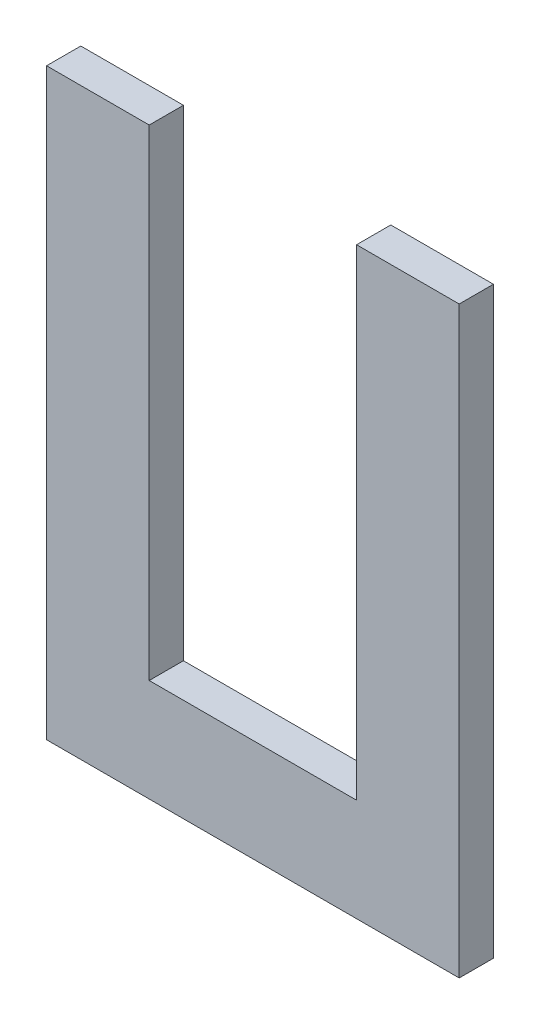
ISO-10303-21;
HEADER;
FILE_DESCRIPTION(('STEP AP214'),'2;1');
FILE_NAME('part.step','',(''),(''),'','','');
FILE_SCHEMA(('AUTOMOTIVE_DESIGN { 1 0 10303 214 1 1 1 1 }'));
ENDSEC;
DATA;
#1=APPLICATION_CONTEXT('core data for automotive mechanical design processes');
#2=APPLICATION_PROTOCOL_DEFINITION('international standard','automotive_design',2000,#1);
#3=PRODUCT_CONTEXT('',#1,'mechanical');
#4=PRODUCT('Part','Part','',(#3));
#5=PRODUCT_RELATED_PRODUCT_CATEGORY('part','',(#4));
#6=PRODUCT_DEFINITION_FORMATION('','',#4);
#7=PRODUCT_DEFINITION_CONTEXT('part definition',#1,'design');
#8=PRODUCT_DEFINITION('design','',#6,#7);
#9=PRODUCT_DEFINITION_SHAPE('','',#8);
#10=(LENGTH_UNIT() NAMED_UNIT(*) SI_UNIT(.MILLI.,.METRE.));
#11=(NAMED_UNIT(*) PLANE_ANGLE_UNIT() SI_UNIT($,.RADIAN.));
#12=(NAMED_UNIT(*) SI_UNIT($,.STERADIAN.) SOLID_ANGLE_UNIT());
#13=UNCERTAINTY_MEASURE_WITH_UNIT(LENGTH_MEASURE(1.E-05),#10,'distance_accuracy_value','');
#14=(GEOMETRIC_REPRESENTATION_CONTEXT(3) GLOBAL_UNCERTAINTY_ASSIGNED_CONTEXT((#13)) GLOBAL_UNIT_ASSIGNED_CONTEXT((#10,
#11,#12)) REPRESENTATION_CONTEXT('',''));
#15=CARTESIAN_POINT('',(0.,0.,0.));
#16=DIRECTION('',(0.,0.,1.));
#17=DIRECTION('',(1.,0.,0.));
#18=AXIS2_PLACEMENT_3D('',#15,#16,#17);
#19=CARTESIAN_POINT('',(-162.491930249026,-715.732729732174,5.));
#20=DIRECTION('',(-1.,0.,0.));
#21=DIRECTION('',(0.,0.,1.));
#22=AXIS2_PLACEMENT_3D('',#19,#20,#21);
#23=PLANE('',#22);
#24=DIRECTION('',(0.,1.,0.));
#25=VECTOR('',#24,1.);
#26=CARTESIAN_POINT('',(-162.491930249026,-715.732729732174,0.));
#27=LINE('',#26,#25);
#28=CARTESIAN_POINT('',(-162.491930249026,-786.032729732174,0.));
#29=VERTEX_POINT('',#28);
#30=CARTESIAN_POINT('',(-162.491930249026,-715.732729732174,0.));
#31=VERTEX_POINT('',#30);
#32=EDGE_CURVE('E146',#29,#31,#27,.T.);
#33=ORIENTED_EDGE('',*,*,#32,.T.);
#34=DIRECTION('',(0.,0.,-1.));
#35=VECTOR('',#34,1.);
#36=CARTESIAN_POINT('',(-162.491930249026,-715.732729732174,5.));
#37=LINE('',#36,#35);
#38=CARTESIAN_POINT('',(-162.491930249026,-715.732729732174,5.));
#39=VERTEX_POINT('',#38);
#40=EDGE_CURVE('E11',#39,#31,#37,.T.);
#41=ORIENTED_EDGE('',*,*,#40,.F.);
#42=DIRECTION('',(0.,1.,0.));
#43=VECTOR('',#42,1.);
#44=CARTESIAN_POINT('',(-162.491930249026,-715.732729732174,5.));
#45=LINE('',#44,#43);
#46=CARTESIAN_POINT('',(-162.491930249026,-786.032729732174,5.));
#47=VERTEX_POINT('',#46);
#48=EDGE_CURVE('E168',#47,#39,#45,.T.);
#49=ORIENTED_EDGE('',*,*,#48,.F.);
#50=DIRECTION('',(0.,0.,-1.));
#51=VECTOR('',#50,1.);
#52=CARTESIAN_POINT('',(-162.491930249026,-786.032729732174,5.));
#53=LINE('',#52,#51);
#54=EDGE_CURVE('E142',#47,#29,#53,.T.);
#55=ORIENTED_EDGE('',*,*,#54,.T.);
#56=EDGE_LOOP('',(#33,#41,#49,#55));
#57=FACE_BOUND('',#56,.T.);
#58=ADVANCED_FACE('F45',(#57),#23,.F.);
#59=CARTESIAN_POINT('',(-162.491930249026,-715.732729732174,5.));
#60=DIRECTION('',(0.,-1.,0.));
#61=DIRECTION('',(0.,0.,-1.));
#62=AXIS2_PLACEMENT_3D('',#59,#60,#61);
#63=PLANE('',#62);
#64=DIRECTION('',(-1.,0.,0.));
#65=VECTOR('',#64,1.);
#66=CARTESIAN_POINT('',(-162.491930249026,-715.732729732174,0.));
#67=LINE('',#66,#65);
#68=CARTESIAN_POINT('',(-177.491930249026,-715.732729732174,0.));
#69=VERTEX_POINT('',#68);
#70=EDGE_CURVE('E150',#31,#69,#67,.T.);
#71=ORIENTED_EDGE('',*,*,#70,.T.);
#72=DIRECTION('',(0.,0.,-1.));
#73=VECTOR('',#72,1.);
#74=CARTESIAN_POINT('',(-177.491930249026,-715.732729732174,5.));
#75=LINE('',#74,#73);
#76=CARTESIAN_POINT('',(-177.491930249026,-715.732729732174,5.));
#77=VERTEX_POINT('',#76);
#78=EDGE_CURVE('E54',#77,#69,#75,.T.);
#79=ORIENTED_EDGE('',*,*,#78,.F.);
#80=DIRECTION('',(-1.,0.,0.));
#81=VECTOR('',#80,1.);
#82=CARTESIAN_POINT('',(-162.491930249026,-715.732729732174,5.));
#83=LINE('',#82,#81);
#84=EDGE_CURVE('E105',#39,#77,#83,.T.);
#85=ORIENTED_EDGE('',*,*,#84,.F.);
#86=ORIENTED_EDGE('',*,*,#40,.T.);
#87=EDGE_LOOP('',(#71,#79,#85,#86));
#88=FACE_BOUND('',#87,.T.);
#89=ADVANCED_FACE('F214',(#88),#63,.F.);
#90=CARTESIAN_POINT('',(-177.491930249026,-715.732729732174,5.));
#91=DIRECTION('',(1.,0.,0.));
#92=DIRECTION('',(0.,0.,-1.));
#93=AXIS2_PLACEMENT_3D('',#90,#91,#92);
#94=PLANE('',#93);
#95=DIRECTION('',(0.,-1.,0.));
#96=VECTOR('',#95,1.);
#97=CARTESIAN_POINT('',(-177.491930249026,-715.732729732174,0.));
#98=LINE('',#97,#96);
#99=CARTESIAN_POINT('',(-177.491930249026,-801.032729732174,0.));
#100=VERTEX_POINT('',#99);
#101=EDGE_CURVE('E153',#69,#100,#98,.T.);
#102=ORIENTED_EDGE('',*,*,#101,.T.);
#103=DIRECTION('',(0.,0.,-1.));
#104=VECTOR('',#103,1.);
#105=CARTESIAN_POINT('',(-177.491930249026,-801.032729732174,5.));
#106=LINE('',#105,#104);
#107=CARTESIAN_POINT('',(-177.491930249026,-801.032729732174,5.));
#108=VERTEX_POINT('',#107);
#109=EDGE_CURVE('E179',#108,#100,#106,.T.);
#110=ORIENTED_EDGE('',*,*,#109,.F.);
#111=DIRECTION('',(0.,-1.,0.));
#112=VECTOR('',#111,1.);
#113=CARTESIAN_POINT('',(-177.491930249026,-715.732729732174,5.));
#114=LINE('',#113,#112);
#115=EDGE_CURVE('E189',#77,#108,#114,.T.);
#116=ORIENTED_EDGE('',*,*,#115,.F.);
#117=ORIENTED_EDGE('',*,*,#78,.T.);
#118=EDGE_LOOP('',(#102,#110,#116,#117));
#119=FACE_BOUND('',#118,.T.);
#120=ADVANCED_FACE('F187',(#119),#94,.F.);
#121=CARTESIAN_POINT('',(-177.491930249026,-801.032729732174,5.));
#122=DIRECTION('',(0.,1.,0.));
#123=DIRECTION('',(0.,0.,1.));
#124=AXIS2_PLACEMENT_3D('',#121,#122,#123);
#125=PLANE('',#124);
#126=DIRECTION('',(1.,0.,0.));
#127=VECTOR('',#126,1.);
#128=CARTESIAN_POINT('',(-177.491930249026,-801.032729732174,0.));
#129=LINE('',#128,#127);
#130=CARTESIAN_POINT('',(-117.191930249026,-801.032729732174,0.));
#131=VERTEX_POINT('',#130);
#132=EDGE_CURVE('E156',#100,#131,#129,.T.);
#133=ORIENTED_EDGE('',*,*,#132,.T.);
#134=DIRECTION('',(0.,0.,-1.));
#135=VECTOR('',#134,1.);
#136=CARTESIAN_POINT('',(-117.191930249026,-801.032729732174,5.));
#137=LINE('',#136,#135);
#138=CARTESIAN_POINT('',(-117.191930249026,-801.032729732174,5.));
#139=VERTEX_POINT('',#138);
#140=EDGE_CURVE('E175',#139,#131,#137,.T.);
#141=ORIENTED_EDGE('',*,*,#140,.F.);
#142=DIRECTION('',(1.,0.,0.));
#143=VECTOR('',#142,1.);
#144=CARTESIAN_POINT('',(-177.491930249026,-801.032729732174,5.));
#145=LINE('',#144,#143);
#146=EDGE_CURVE('E202',#108,#139,#145,.T.);
#147=ORIENTED_EDGE('',*,*,#146,.F.);
#148=ORIENTED_EDGE('',*,*,#109,.T.);
#149=EDGE_LOOP('',(#133,#141,#147,#148));
#150=FACE_BOUND('',#149,.T.);
#151=ADVANCED_FACE('F197',(#150),#125,.F.);
#152=CARTESIAN_POINT('',(-117.191930249026,-801.032729732174,5.));
#153=DIRECTION('',(-1.,0.,0.));
#154=DIRECTION('',(0.,0.,1.));
#155=AXIS2_PLACEMENT_3D('',#152,#153,#154);
#156=PLANE('',#155);
#157=DIRECTION('',(0.,1.,0.));
#158=VECTOR('',#157,1.);
#159=CARTESIAN_POINT('',(-117.191930249026,-801.032729732174,0.));
#160=LINE('',#159,#158);
#161=CARTESIAN_POINT('',(-117.191930249026,-715.732729732174,0.));
#162=VERTEX_POINT('',#161);
#163=EDGE_CURVE('E159',#131,#162,#160,.T.);
#164=ORIENTED_EDGE('',*,*,#163,.T.);
#165=DIRECTION('',(0.,0.,-1.));
#166=VECTOR('',#165,1.);
#167=CARTESIAN_POINT('',(-117.191930249026,-715.732729732174,5.));
#168=LINE('',#167,#166);
#169=CARTESIAN_POINT('',(-117.191930249026,-715.732729732174,5.));
#170=VERTEX_POINT('',#169);
#171=EDGE_CURVE('E135',#170,#162,#168,.T.);
#172=ORIENTED_EDGE('',*,*,#171,.F.);
#173=DIRECTION('',(0.,1.,0.));
#174=VECTOR('',#173,1.);
#175=CARTESIAN_POINT('',(-117.191930249026,-801.032729732174,5.));
#176=LINE('',#175,#174);
#177=EDGE_CURVE('E124',#139,#170,#176,.T.);
#178=ORIENTED_EDGE('',*,*,#177,.F.);
#179=ORIENTED_EDGE('',*,*,#140,.T.);
#180=EDGE_LOOP('',(#164,#172,#178,#179));
#181=FACE_BOUND('',#180,.T.);
#182=ADVANCED_FACE('F200',(#181),#156,.F.);
#183=CARTESIAN_POINT('',(-117.191930249026,-715.732729732174,5.));
#184=DIRECTION('',(0.,-1.,0.));
#185=DIRECTION('',(0.,0.,-1.));
#186=AXIS2_PLACEMENT_3D('',#183,#184,#185);
#187=PLANE('',#186);
#188=DIRECTION('',(-1.,0.,0.));
#189=VECTOR('',#188,1.);
#190=CARTESIAN_POINT('',(-117.191930249026,-715.732729732174,0.));
#191=LINE('',#190,#189);
#192=CARTESIAN_POINT('',(-132.191930249026,-715.732729732174,0.));
#193=VERTEX_POINT('',#192);
#194=EDGE_CURVE('E133',#162,#193,#191,.T.);
#195=ORIENTED_EDGE('',*,*,#194,.T.);
#196=DIRECTION('',(0.,0.,-1.));
#197=VECTOR('',#196,1.);
#198=CARTESIAN_POINT('',(-132.191930249026,-715.732729732174,5.));
#199=LINE('',#198,#197);
#200=CARTESIAN_POINT('',(-132.191930249026,-715.732729732174,5.));
#201=VERTEX_POINT('',#200);
#202=EDGE_CURVE('E130',#201,#193,#199,.T.);
#203=ORIENTED_EDGE('',*,*,#202,.F.);
#204=DIRECTION('',(-1.,0.,0.));
#205=VECTOR('',#204,1.);
#206=CARTESIAN_POINT('',(-117.191930249026,-715.732729732174,5.));
#207=LINE('',#206,#205);
#208=EDGE_CURVE('E118',#170,#201,#207,.T.);
#209=ORIENTED_EDGE('',*,*,#208,.F.);
#210=ORIENTED_EDGE('',*,*,#171,.T.);
#211=EDGE_LOOP('',(#195,#203,#209,#210));
#212=FACE_BOUND('',#211,.T.);
#213=ADVANCED_FACE('F131',(#212),#187,.F.);
#214=CARTESIAN_POINT('',(-132.191930249026,-715.732729732174,5.));
#215=DIRECTION('',(1.,0.,0.));
#216=DIRECTION('',(0.,1.,0.));
#217=AXIS2_PLACEMENT_3D('',#214,#215,#216);
#218=PLANE('',#217);
#219=DIRECTION('',(0.,-1.,0.));
#220=VECTOR('',#219,1.);
#221=CARTESIAN_POINT('',(-132.191930249026,-715.732729732174,0.));
#222=LINE('',#221,#220);
#223=CARTESIAN_POINT('',(-132.191930249026,-786.032729732174,0.));
#224=VERTEX_POINT('',#223);
#225=EDGE_CURVE('E91',#193,#224,#222,.T.);
#226=ORIENTED_EDGE('',*,*,#225,.T.);
#227=DIRECTION('',(0.,0.,-1.));
#228=VECTOR('',#227,1.);
#229=CARTESIAN_POINT('',(-132.191930249026,-786.032729732174,5.));
#230=LINE('',#229,#228);
#231=CARTESIAN_POINT('',(-132.191930249026,-786.032729732174,5.));
#232=VERTEX_POINT('',#231);
#233=EDGE_CURVE('E136',#232,#224,#230,.T.);
#234=ORIENTED_EDGE('',*,*,#233,.F.);
#235=DIRECTION('',(0.,-1.,0.));
#236=VECTOR('',#235,1.);
#237=CARTESIAN_POINT('',(-132.191930249026,-715.732729732174,5.));
#238=LINE('',#237,#236);
#239=EDGE_CURVE('E122',#201,#232,#238,.T.);
#240=ORIENTED_EDGE('',*,*,#239,.F.);
#241=ORIENTED_EDGE('',*,*,#202,.T.);
#242=EDGE_LOOP('',(#226,#234,#240,#241));
#243=FACE_BOUND('',#242,.T.);
#244=ADVANCED_FACE('F138',(#243),#218,.F.);
#245=CARTESIAN_POINT('',(-162.491930249026,-786.032729732174,5.));
#246=DIRECTION('',(0.,-1.,0.));
#247=DIRECTION('',(0.,0.,-1.));
#248=AXIS2_PLACEMENT_3D('',#245,#246,#247);
#249=PLANE('',#248);
#250=DIRECTION('',(-1.,0.,0.));
#251=VECTOR('',#250,1.);
#252=CARTESIAN_POINT('',(-162.491930249026,-786.032729732174,0.));
#253=LINE('',#252,#251);
#254=EDGE_CURVE('E97',#224,#29,#253,.T.);
#255=ORIENTED_EDGE('',*,*,#254,.T.);
#256=ORIENTED_EDGE('',*,*,#54,.F.);
#257=DIRECTION('',(-1.,0.,0.));
#258=VECTOR('',#257,1.);
#259=CARTESIAN_POINT('',(-162.491930249026,-786.032729732174,5.));
#260=LINE('',#259,#258);
#261=EDGE_CURVE('E62',#232,#47,#260,.T.);
#262=ORIENTED_EDGE('',*,*,#261,.F.);
#263=ORIENTED_EDGE('',*,*,#233,.T.);
#264=EDGE_LOOP('',(#255,#256,#262,#263));
#265=FACE_BOUND('',#264,.T.);
#266=ADVANCED_FACE('F230',(#265),#249,.F.);
#267=CARTESIAN_POINT('',(0.,0.,5.));
#268=DIRECTION('',(0.,0.,1.));
#269=DIRECTION('',(1.,0.,0.));
#270=AXIS2_PLACEMENT_3D('',#267,#268,#269);
#271=PLANE('',#270);
#272=ORIENTED_EDGE('',*,*,#48,.T.);
#273=ORIENTED_EDGE('',*,*,#84,.T.);
#274=ORIENTED_EDGE('',*,*,#115,.T.);
#275=ORIENTED_EDGE('',*,*,#146,.T.);
#276=ORIENTED_EDGE('',*,*,#177,.T.);
#277=ORIENTED_EDGE('',*,*,#208,.T.);
#278=ORIENTED_EDGE('',*,*,#239,.T.);
#279=ORIENTED_EDGE('',*,*,#261,.T.);
#280=EDGE_LOOP('',(#272,#273,#274,#275,#276,#277,#278,#279));
#281=FACE_BOUND('',#280,.T.);
#282=ADVANCED_FACE('F120',(#281),#271,.T.);
#283=CARTESIAN_POINT('',(0.,0.,0.));
#284=DIRECTION('',(0.,0.,1.));
#285=DIRECTION('',(1.,0.,0.));
#286=AXIS2_PLACEMENT_3D('',#283,#284,#285);
#287=PLANE('',#286);
#288=ORIENTED_EDGE('',*,*,#32,.F.);
#289=ORIENTED_EDGE('',*,*,#254,.F.);
#290=ORIENTED_EDGE('',*,*,#225,.F.);
#291=ORIENTED_EDGE('',*,*,#194,.F.);
#292=ORIENTED_EDGE('',*,*,#163,.F.);
#293=ORIENTED_EDGE('',*,*,#132,.F.);
#294=ORIENTED_EDGE('',*,*,#101,.F.);
#295=ORIENTED_EDGE('',*,*,#70,.F.);
#296=EDGE_LOOP('',(#288,#289,#290,#291,#292,#293,#294,#295));
#297=FACE_BOUND('',#296,.T.);
#298=ADVANCED_FACE('F193',(#297),#287,.F.);
#299=CLOSED_SHELL('',(#58,#89,#120,#151,#182,#213,#244,#266,#282,#298));
#300=MANIFOLD_SOLID_BREP('B2',#299);
#301=ADVANCED_BREP_SHAPE_REPRESENTATION('',(#18,#300),#14);
#302=SHAPE_DEFINITION_REPRESENTATION(#9,#301);
ENDSEC;
END-ISO-10303-21;
